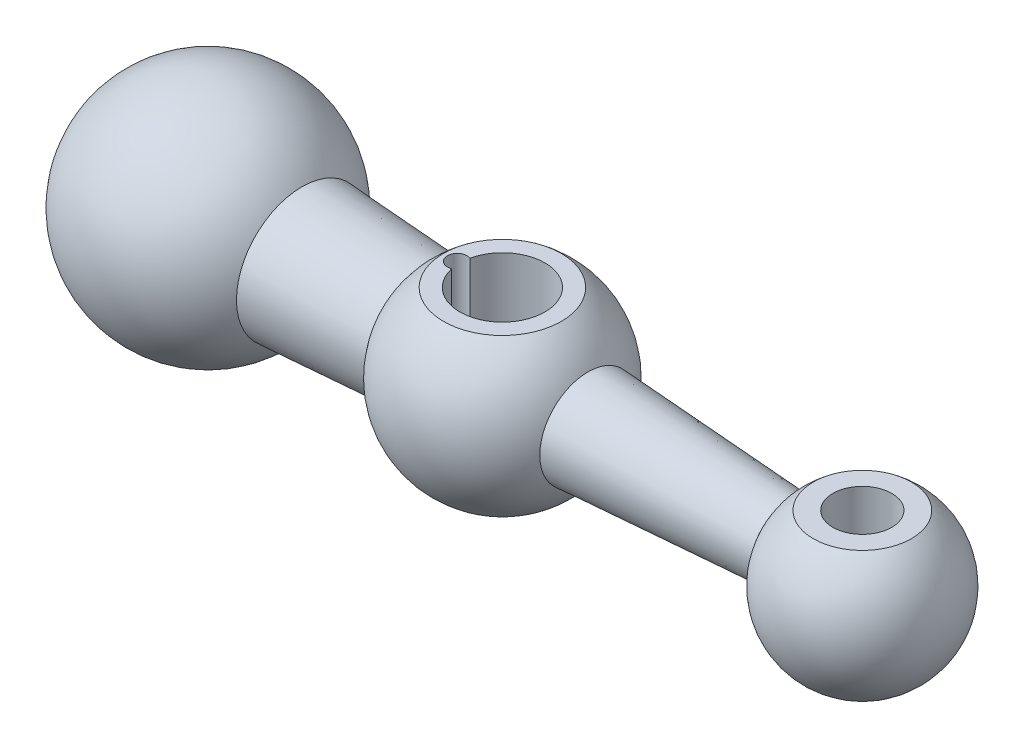
ISO-10303-21;
HEADER;
FILE_DESCRIPTION(('STEP AP214'),'2;1');
FILE_NAME('part.step','',(''),(''),'','','');
FILE_SCHEMA(('AUTOMOTIVE_DESIGN { 1 0 10303 214 1 1 1 1 }'));
ENDSEC;
DATA;
#1=APPLICATION_CONTEXT('core data for automotive mechanical design processes');
#2=APPLICATION_PROTOCOL_DEFINITION('international standard','automotive_design',2000,#1);
#3=PRODUCT_CONTEXT('',#1,'mechanical');
#4=PRODUCT('Part','Part','',(#3));
#5=PRODUCT_RELATED_PRODUCT_CATEGORY('part','',(#4));
#6=PRODUCT_DEFINITION_FORMATION('','',#4);
#7=PRODUCT_DEFINITION_CONTEXT('part definition',#1,'design');
#8=PRODUCT_DEFINITION('design','',#6,#7);
#9=PRODUCT_DEFINITION_SHAPE('','',#8);
#10=(LENGTH_UNIT() NAMED_UNIT(*) SI_UNIT(.MILLI.,.METRE.));
#11=(NAMED_UNIT(*) PLANE_ANGLE_UNIT() SI_UNIT($,.RADIAN.));
#12=(NAMED_UNIT(*) SI_UNIT($,.STERADIAN.) SOLID_ANGLE_UNIT());
#13=UNCERTAINTY_MEASURE_WITH_UNIT(LENGTH_MEASURE(1.E-05),#10,'distance_accuracy_value','');
#14=(GEOMETRIC_REPRESENTATION_CONTEXT(3) GLOBAL_UNCERTAINTY_ASSIGNED_CONTEXT((#13)) GLOBAL_UNIT_ASSIGNED_CONTEXT((#10,
#11,#12)) REPRESENTATION_CONTEXT('',''));
#15=CARTESIAN_POINT('',(0.,0.,0.));
#16=DIRECTION('',(0.,0.,1.));
#17=DIRECTION('',(1.,0.,0.));
#18=AXIS2_PLACEMENT_3D('',#15,#16,#17);
#19=CARTESIAN_POINT('',(100.,0.,0.));
#20=DIRECTION('',(-1.,0.,0.));
#21=DIRECTION('',(0.,1.,0.));
#22=AXIS2_PLACEMENT_3D('',#19,#20,#21);
#23=SPHERICAL_SURFACE('',#22,12.5);
#24=CARTESIAN_POINT('',(88.7750278396782,0.,0.));
#25=DIRECTION('',(-1.,0.,0.));
#26=DIRECTION('',(0.,0.,1.));
#27=AXIS2_PLACEMENT_3D('',#24,#25,#26);
#28=CIRCLE('',#27,5.5);
#29=CARTESIAN_POINT('',(88.7750278396782,0.,5.5));
#30=VERTEX_POINT('',#29);
#31=EDGE_CURVE('E106',#30,#30,#28,.T.);
#32=ORIENTED_EDGE('',*,*,#31,.F.);
#33=EDGE_LOOP('',(#32));
#34=FACE_BOUND('',#33,.T.);
#35=CARTESIAN_POINT('',(100.,10.,0.));
#36=DIRECTION('',(0.,1.,0.));
#37=DIRECTION('',(0.,0.,1.));
#38=AXIS2_PLACEMENT_3D('',#35,#36,#37);
#39=CIRCLE('',#38,7.5);
#40=CARTESIAN_POINT('',(100.,10.,7.5));
#41=VERTEX_POINT('',#40);
#42=EDGE_CURVE('E123',#41,#41,#39,.T.);
#43=ORIENTED_EDGE('',*,*,#42,.F.);
#44=EDGE_LOOP('',(#43));
#45=FACE_BOUND('',#44,.T.);
#46=ADVANCED_FACE('F51',(#34,#45),#23,.T.);
#47=CARTESIAN_POINT('',(0.,0.,0.));
#48=DIRECTION('',(-1.,0.,0.));
#49=DIRECTION('',(0.,1.,0.));
#50=AXIS2_PLACEMENT_3D('',#47,#48,#49);
#51=SPHERICAL_SURFACE('',#50,17.5);
#52=CARTESIAN_POINT('',(14.3614066163451,0.,0.));
#53=DIRECTION('',(-1.,0.,0.));
#54=DIRECTION('',(0.,0.,1.));
#55=AXIS2_PLACEMENT_3D('',#52,#53,#54);
#56=CIRCLE('',#55,10.);
#57=CARTESIAN_POINT('',(14.3614066163451,0.,10.));
#58=VERTEX_POINT('',#57);
#59=EDGE_CURVE('E119',#58,#58,#56,.T.);
#60=ORIENTED_EDGE('',*,*,#59,.T.);
#61=EDGE_LOOP('',(#60));
#62=FACE_BOUND('',#61,.T.);
#63=ADVANCED_FACE('F53',(#62),#51,.T.);
#64=CARTESIAN_POINT('',(58.0720716641531,0.,0.));
#65=DIRECTION('',(-1.,0.,0.));
#66=DIRECTION('',(0.,0.,1.));
#67=AXIS2_PLACEMENT_3D('',#64,#65,#66);
#68=CONICAL_SURFACE('',#67,7.35669371438331,0.0603992453471645);
#69=ORIENTED_EDGE('',*,*,#31,.T.);
#70=EDGE_LOOP('',(#69));
#71=FACE_BOUND('',#70,.T.);
#72=CARTESIAN_POINT('',(58.0720716641531,0.,0.));
#73=DIRECTION('',(-1.,0.,0.));
#74=DIRECTION('',(0.,0.,1.));
#75=AXIS2_PLACEMENT_3D('',#72,#73,#74);
#76=CIRCLE('',#75,7.35669371438331);
#77=CARTESIAN_POINT('',(58.0720716641531,0.,7.35669371438331));
#78=VERTEX_POINT('',#77);
#79=EDGE_CURVE('E111',#78,#78,#76,.T.);
#80=ORIENTED_EDGE('',*,*,#79,.F.);
#81=EDGE_LOOP('',(#80));
#82=FACE_BOUND('',#81,.T.);
#83=ADVANCED_FACE('F162',(#71,#82),#68,.T.);
#84=CARTESIAN_POINT('',(45.,0.,0.));
#85=DIRECTION('',(-1.,0.,0.));
#86=DIRECTION('',(0.,1.,0.));
#87=AXIS2_PLACEMENT_3D('',#84,#85,#86);
#88=SPHERICAL_SURFACE('',#87,15.);
#89=CARTESIAN_POINT('',(45.,12.,0.));
#90=DIRECTION('',(0.,-1.,0.));
#91=DIRECTION('',(0.,0.,-1.));
#92=AXIS2_PLACEMENT_3D('',#89,#90,#91);
#93=CIRCLE('',#92,9.);
#94=CARTESIAN_POINT('',(45.,12.,-9.));
#95=VERTEX_POINT('',#94);
#96=EDGE_CURVE('E103',#95,#95,#93,.T.);
#97=ORIENTED_EDGE('',*,*,#96,.T.);
#98=EDGE_LOOP('',(#97));
#99=FACE_BOUND('',#98,.T.);
#100=CARTESIAN_POINT('',(45.,-12.,0.));
#101=DIRECTION('',(0.,1.,0.));
#102=DIRECTION('',(0.,0.,1.));
#103=AXIS2_PLACEMENT_3D('',#100,#101,#102);
#104=CIRCLE('',#103,9.);
#105=CARTESIAN_POINT('',(45.,-12.,9.));
#106=VERTEX_POINT('',#105);
#107=EDGE_CURVE('E98',#106,#106,#104,.T.);
#108=ORIENTED_EDGE('',*,*,#107,.T.);
#109=EDGE_LOOP('',(#108));
#110=FACE_BOUND('',#109,.T.);
#111=CARTESIAN_POINT('',(32.9097058169818,0.,0.));
#112=DIRECTION('',(-1.,0.,0.));
#113=DIRECTION('',(0.,0.,1.));
#114=AXIS2_PLACEMENT_3D('',#111,#112,#113);
#115=CIRCLE('',#114,8.87833242045351);
#116=CARTESIAN_POINT('',(32.9097058169818,0.,8.87833242045351));
#117=VERTEX_POINT('',#116);
#118=EDGE_CURVE('E115',#117,#117,#115,.T.);
#119=ORIENTED_EDGE('',*,*,#118,.F.);
#120=EDGE_LOOP('',(#119));
#121=FACE_BOUND('',#120,.T.);
#122=ORIENTED_EDGE('',*,*,#79,.T.);
#123=EDGE_LOOP('',(#122));
#124=FACE_BOUND('',#123,.T.);
#125=ADVANCED_FACE('F141',(#99,#110,#121,#124),#88,.T.);
#126=CARTESIAN_POINT('',(14.3614066163451,0.,0.));
#127=DIRECTION('',(-1.,0.,0.));
#128=DIRECTION('',(0.,0.,1.));
#129=AXIS2_PLACEMENT_3D('',#126,#127,#128);
#130=CONICAL_SURFACE('',#129,10.,0.0603992453471646);
#131=ORIENTED_EDGE('',*,*,#118,.T.);
#132=EDGE_LOOP('',(#131));
#133=FACE_BOUND('',#132,.T.);
#134=ORIENTED_EDGE('',*,*,#59,.F.);
#135=EDGE_LOOP('',(#134));
#136=FACE_BOUND('',#135,.T.);
#137=ADVANCED_FACE('F172',(#133,#136),#130,.T.);
#138=CARTESIAN_POINT('',(100.,10.,0.));
#139=DIRECTION('',(0.,1.,0.));
#140=DIRECTION('',(0.,0.,1.));
#141=AXIS2_PLACEMENT_3D('',#138,#139,#140);
#142=PLANE('',#141);
#143=CARTESIAN_POINT('',(100.,10.,0.));
#144=DIRECTION('',(0.,1.,0.));
#145=DIRECTION('',(0.,0.,1.));
#146=AXIS2_PLACEMENT_3D('',#143,#144,#145);
#147=CIRCLE('',#146,4.49999999999999);
#148=CARTESIAN_POINT('',(100.,10.,4.49999999999999));
#149=VERTEX_POINT('',#148);
#150=EDGE_CURVE('E131',#149,#149,#147,.T.);
#151=ORIENTED_EDGE('',*,*,#150,.F.);
#152=EDGE_LOOP('',(#151));
#153=FACE_BOUND('',#152,.T.);
#154=ORIENTED_EDGE('',*,*,#42,.T.);
#155=EDGE_LOOP('',(#154));
#156=FACE_BOUND('',#155,.T.);
#157=ADVANCED_FACE('F176',(#153,#156),#142,.T.);
#158=CARTESIAN_POINT('',(100.,-9.,0.));
#159=DIRECTION('',(0.,-1.,0.));
#160=DIRECTION('',(0.,0.,-1.));
#161=AXIS2_PLACEMENT_3D('',#158,#159,#160);
#162=PLANE('',#161);
#163=CARTESIAN_POINT('',(100.,-9.,0.));
#164=DIRECTION('',(0.,1.,0.));
#165=DIRECTION('',(0.,0.,1.));
#166=AXIS2_PLACEMENT_3D('',#163,#164,#165);
#167=CIRCLE('',#166,4.49999999999999);
#168=CARTESIAN_POINT('',(100.,-9.,4.49999999999999));
#169=VERTEX_POINT('',#168);
#170=EDGE_CURVE('E127',#169,#169,#167,.T.);
#171=ORIENTED_EDGE('',*,*,#170,.T.);
#172=EDGE_LOOP('',(#171));
#173=FACE_BOUND('',#172,.T.);
#174=ADVANCED_FACE('F154',(#173),#162,.F.);
#175=CARTESIAN_POINT('',(100.,10.,0.));
#176=DIRECTION('',(0.,1.,0.));
#177=DIRECTION('',(0.,0.,1.));
#178=AXIS2_PLACEMENT_3D('',#175,#176,#177);
#179=CYLINDRICAL_SURFACE('',#178,4.49999999999999);
#180=ORIENTED_EDGE('',*,*,#170,.F.);
#181=EDGE_LOOP('',(#180));
#182=FACE_BOUND('',#181,.T.);
#183=ORIENTED_EDGE('',*,*,#150,.T.);
#184=EDGE_LOOP('',(#183));
#185=FACE_BOUND('',#184,.T.);
#186=ADVANCED_FACE('F146',(#182,#185),#179,.F.);
#187=CARTESIAN_POINT('',(28.1659473532912,-12.,-17.5));
#188=DIRECTION('',(0.,1.,0.));
#189=DIRECTION('',(0.,0.,1.));
#190=AXIS2_PLACEMENT_3D('',#187,#188,#189);
#191=PLANE('',#190);
#192=CARTESIAN_POINT('',(45.,-12.,0.));
#193=DIRECTION('',(0.,1.,0.));
#194=DIRECTION('',(0.,0.,1.));
#195=AXIS2_PLACEMENT_3D('',#192,#193,#194);
#196=CIRCLE('',#195,6.5);
#197=CARTESIAN_POINT('',(45.,-12.,6.5));
#198=VERTEX_POINT('',#197);
#199=EDGE_CURVE('E93',#198,#198,#196,.T.);
#200=ORIENTED_EDGE('',*,*,#199,.T.);
#201=EDGE_LOOP('',(#200));
#202=FACE_BOUND('',#201,.T.);
#203=ORIENTED_EDGE('',*,*,#107,.F.);
#204=EDGE_LOOP('',(#203));
#205=FACE_BOUND('',#204,.T.);
#206=ADVANCED_FACE('F144',(#202,#205),#191,.F.);
#207=CARTESIAN_POINT('',(28.1659473532912,12.,-17.5));
#208=DIRECTION('',(0.,-1.,0.));
#209=DIRECTION('',(0.,0.,-1.));
#210=AXIS2_PLACEMENT_3D('',#207,#208,#209);
#211=PLANE('',#210);
#212=CARTESIAN_POINT('',(45.,12.,0.));
#213=DIRECTION('',(0.,-1.,0.));
#214=DIRECTION('',(0.,0.,-1.));
#215=AXIS2_PLACEMENT_3D('',#212,#213,#214);
#216=CIRCLE('',#215,6.5);
#217=CARTESIAN_POINT('',(38.651727749484,12.,-1.39622327488407));
#218=VERTEX_POINT('',#217);
#219=CARTESIAN_POINT('',(38.651727749484,12.,1.39622327488407));
#220=VERTEX_POINT('',#219);
#221=EDGE_CURVE('E89',#218,#220,#216,.T.);
#222=ORIENTED_EDGE('',*,*,#221,.T.);
#223=CARTESIAN_POINT('',(38.1034937057836,12.,0.));
#224=DIRECTION('',(0.,1.,0.));
#225=DIRECTION('',(0.,0.,1.));
#226=AXIS2_PLACEMENT_3D('',#223,#224,#225);
#227=CIRCLE('',#226,1.5);
#228=EDGE_CURVE('E78',#218,#220,#227,.T.);
#229=ORIENTED_EDGE('',*,*,#228,.F.);
#230=EDGE_LOOP('',(#222,#229));
#231=FACE_BOUND('',#230,.T.);
#232=ORIENTED_EDGE('',*,*,#96,.F.);
#233=EDGE_LOOP('',(#232));
#234=FACE_BOUND('',#233,.T.);
#235=ADVANCED_FACE('F90',(#231,#234),#211,.F.);
#236=CARTESIAN_POINT('',(45.,-17.5,0.));
#237=DIRECTION('',(0.,1.,0.));
#238=DIRECTION('',(0.,0.,1.));
#239=AXIS2_PLACEMENT_3D('',#236,#237,#238);
#240=CYLINDRICAL_SURFACE('',#239,6.5);
#241=CARTESIAN_POINT('',(45.,0.,0.));
#242=DIRECTION('',(0.,1.,0.));
#243=DIRECTION('',(0.,0.,1.));
#244=AXIS2_PLACEMENT_3D('',#241,#242,#243);
#245=CIRCLE('',#244,6.5);
#246=CARTESIAN_POINT('',(38.651727749484,0.,1.39622327488407));
#247=VERTEX_POINT('',#246);
#248=CARTESIAN_POINT('',(38.651727749484,0.,-1.39622327488407));
#249=VERTEX_POINT('',#248);
#250=EDGE_CURVE('E70',#247,#249,#245,.F.);
#251=ORIENTED_EDGE('',*,*,#250,.F.);
#252=DIRECTION('',(0.,1.,0.));
#253=VECTOR('',#252,1.);
#254=CARTESIAN_POINT('',(38.651727749484,6.,1.39622327488407));
#255=LINE('',#254,#253);
#256=EDGE_CURVE('E11',#247,#220,#255,.T.);
#257=ORIENTED_EDGE('',*,*,#256,.T.);
#258=ORIENTED_EDGE('',*,*,#221,.F.);
#259=DIRECTION('',(0.,1.,0.));
#260=VECTOR('',#259,1.);
#261=CARTESIAN_POINT('',(38.651727749484,6.,-1.39622327488407));
#262=LINE('',#261,#260);
#263=EDGE_CURVE('E60',#218,#249,#262,.F.);
#264=ORIENTED_EDGE('',*,*,#263,.T.);
#265=EDGE_LOOP('',(#251,#257,#258,#264));
#266=FACE_BOUND('',#265,.T.);
#267=ORIENTED_EDGE('',*,*,#199,.F.);
#268=EDGE_LOOP('',(#267));
#269=FACE_BOUND('',#268,.T.);
#270=ADVANCED_FACE('F87',(#266,#269),#240,.F.);
#271=CARTESIAN_POINT('',(38.1034937057836,0.,0.));
#272=DIRECTION('',(0.,1.,0.));
#273=DIRECTION('',(0.,0.,1.));
#274=AXIS2_PLACEMENT_3D('',#271,#272,#273);
#275=CYLINDRICAL_SURFACE('',#274,1.5);
#276=CARTESIAN_POINT('',(38.1034937057836,0.,0.));
#277=DIRECTION('',(0.,1.,0.));
#278=DIRECTION('',(0.,0.,1.));
#279=AXIS2_PLACEMENT_3D('',#276,#277,#278);
#280=CIRCLE('',#279,1.5);
#281=EDGE_CURVE('E66',#249,#247,#280,.T.);
#282=ORIENTED_EDGE('',*,*,#281,.F.);
#283=ORIENTED_EDGE('',*,*,#263,.F.);
#284=ORIENTED_EDGE('',*,*,#228,.T.);
#285=ORIENTED_EDGE('',*,*,#256,.F.);
#286=EDGE_LOOP('',(#282,#283,#284,#285));
#287=FACE_BOUND('',#286,.T.);
#288=ADVANCED_FACE('F79',(#287),#275,.F.);
#289=CARTESIAN_POINT('',(38.1034937057836,0.,0.));
#290=DIRECTION('',(0.,1.,0.));
#291=DIRECTION('',(0.,0.,1.));
#292=AXIS2_PLACEMENT_3D('',#289,#290,#291);
#293=PLANE('',#292);
#294=ORIENTED_EDGE('',*,*,#250,.T.);
#295=ORIENTED_EDGE('',*,*,#281,.T.);
#296=EDGE_LOOP('',(#294,#295));
#297=FACE_BOUND('',#296,.T.);
#298=ADVANCED_FACE('F275',(#297),#293,.T.);
#299=CLOSED_SHELL('',(#46,#63,#83,#125,#137,#157,#174,#186,#206,#235,#270,#288,#298));
#300=MANIFOLD_SOLID_BREP('B2',#299);
#301=ADVANCED_BREP_SHAPE_REPRESENTATION('',(#18,#300),#14);
#302=SHAPE_DEFINITION_REPRESENTATION(#9,#301);
ENDSEC;
END-ISO-10303-21;
